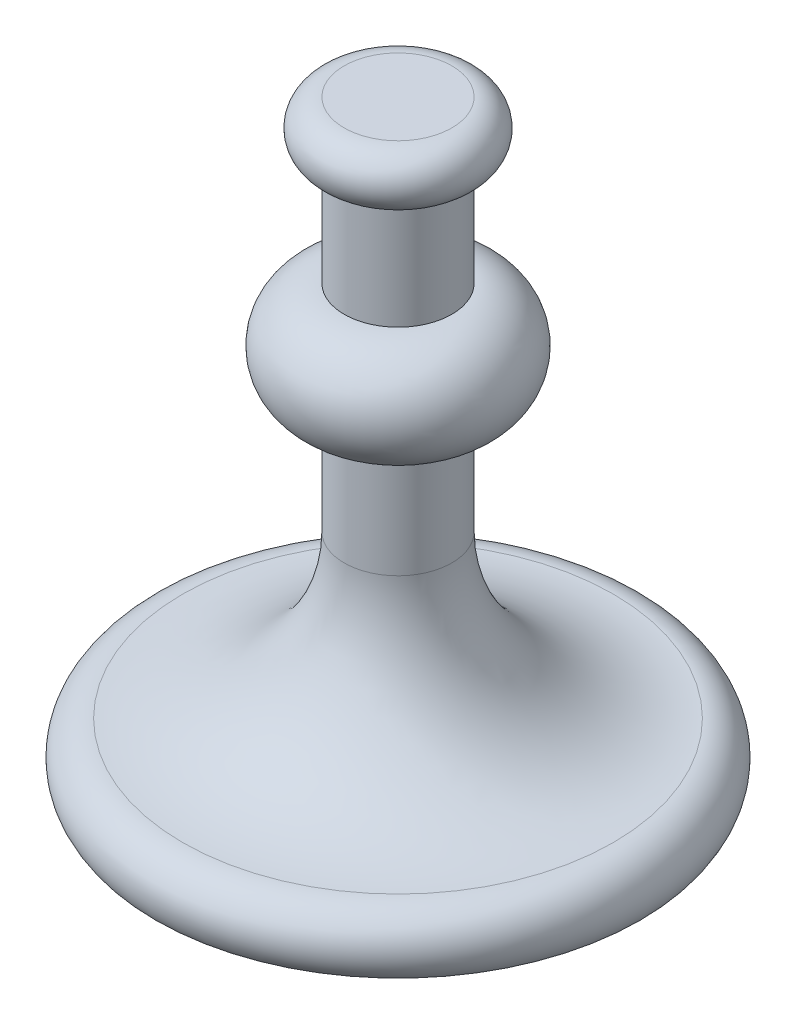
ISO-10303-21;
HEADER;
FILE_DESCRIPTION(('STEP AP214'),'2;1');
FILE_NAME('part.step','',(''),(''),'','','');
FILE_SCHEMA(('AUTOMOTIVE_DESIGN { 1 0 10303 214 1 1 1 1 }'));
ENDSEC;
DATA;
#1=APPLICATION_CONTEXT('core data for automotive mechanical design processes');
#2=APPLICATION_PROTOCOL_DEFINITION('international standard','automotive_design',2000,#1);
#3=PRODUCT_CONTEXT('',#1,'mechanical');
#4=PRODUCT('Part','Part','',(#3));
#5=PRODUCT_RELATED_PRODUCT_CATEGORY('part','',(#4));
#6=PRODUCT_DEFINITION_FORMATION('','',#4);
#7=PRODUCT_DEFINITION_CONTEXT('part definition',#1,'design');
#8=PRODUCT_DEFINITION('design','',#6,#7);
#9=PRODUCT_DEFINITION_SHAPE('','',#8);
#10=(LENGTH_UNIT() NAMED_UNIT(*) SI_UNIT(.MILLI.,.METRE.));
#11=(NAMED_UNIT(*) PLANE_ANGLE_UNIT() SI_UNIT($,.RADIAN.));
#12=(NAMED_UNIT(*) SI_UNIT($,.STERADIAN.) SOLID_ANGLE_UNIT());
#13=UNCERTAINTY_MEASURE_WITH_UNIT(LENGTH_MEASURE(1.E-05),#10,'distance_accuracy_value','');
#14=(GEOMETRIC_REPRESENTATION_CONTEXT(3) GLOBAL_UNCERTAINTY_ASSIGNED_CONTEXT((#13)) GLOBAL_UNIT_ASSIGNED_CONTEXT((#10,
#11,#12)) REPRESENTATION_CONTEXT('',''));
#15=CARTESIAN_POINT('',(0.,0.,0.));
#16=DIRECTION('',(0.,0.,1.));
#17=DIRECTION('',(1.,0.,0.));
#18=AXIS2_PLACEMENT_3D('',#15,#16,#17);
#19=CARTESIAN_POINT('',(0.,0.,0.));
#20=DIRECTION('',(0.,-1.,0.));
#21=DIRECTION('',(0.,0.,-1.));
#22=AXIS2_PLACEMENT_3D('',#19,#20,#21);
#23=PLANE('',#22);
#24=CARTESIAN_POINT('',(0.,0.,0.));
#25=DIRECTION('',(0.,-1.,0.));
#26=DIRECTION('',(0.,0.,-1.));
#27=AXIS2_PLACEMENT_3D('',#24,#25,#26);
#28=CIRCLE('',#27,90.);
#29=CARTESIAN_POINT('',(0.,0.,-90.));
#30=VERTEX_POINT('',#29);
#31=EDGE_CURVE('E73',#30,#30,#28,.T.);
#32=ORIENTED_EDGE('',*,*,#31,.T.);
#33=EDGE_LOOP('',(#32));
#34=FACE_BOUND('',#33,.T.);
#35=ADVANCED_FACE('F43',(#34),#23,.T.);
#36=CARTESIAN_POINT('',(0.,220.,0.));
#37=DIRECTION('',(0.,1.,0.));
#38=DIRECTION('',(0.,0.,1.));
#39=AXIS2_PLACEMENT_3D('',#36,#37,#38);
#40=PLANE('',#39);
#41=CARTESIAN_POINT('',(0.,220.,0.));
#42=DIRECTION('',(0.,-1.,0.));
#43=DIRECTION('',(0.,0.,-1.));
#44=AXIS2_PLACEMENT_3D('',#41,#42,#43);
#45=CIRCLE('',#44,20.);
#46=CARTESIAN_POINT('',(0.,220.,-20.));
#47=VERTEX_POINT('',#46);
#48=EDGE_CURVE('E10',#47,#47,#45,.T.);
#49=ORIENTED_EDGE('',*,*,#48,.F.);
#50=EDGE_LOOP('',(#49));
#51=FACE_BOUND('',#50,.T.);
#52=ADVANCED_FACE('F95',(#51),#40,.T.);
#53=CARTESIAN_POINT('',(0.,210.,0.));
#54=DIRECTION('',(0.,-1.,0.));
#55=DIRECTION('',(0.,0.,-1.));
#56=AXIS2_PLACEMENT_3D('',#53,#54,#55);
#57=TOROIDAL_SURFACE('',#56,20.,9.99999999999999);
#58=ORIENTED_EDGE('',*,*,#48,.T.);
#59=EDGE_LOOP('',(#58));
#60=FACE_BOUND('',#59,.T.);
#61=CARTESIAN_POINT('',(0.,200.,0.));
#62=DIRECTION('',(0.,-1.,0.));
#63=DIRECTION('',(0.,0.,-1.));
#64=AXIS2_PLACEMENT_3D('',#61,#62,#63);
#65=CIRCLE('',#64,20.);
#66=CARTESIAN_POINT('',(0.,200.,-20.));
#67=VERTEX_POINT('',#66);
#68=EDGE_CURVE('E49',#67,#67,#65,.T.);
#69=ORIENTED_EDGE('',*,*,#68,.F.);
#70=EDGE_LOOP('',(#69));
#71=FACE_BOUND('',#70,.T.);
#72=ADVANCED_FACE('F96',(#60,#71),#57,.T.);
#73=CARTESIAN_POINT('',(0.,0.,0.));
#74=DIRECTION('',(0.,-1.,0.));
#75=DIRECTION('',(0.,0.,-1.));
#76=AXIS2_PLACEMENT_3D('',#73,#74,#75);
#77=CYLINDRICAL_SURFACE('',#76,20.);
#78=ORIENTED_EDGE('',*,*,#68,.T.);
#79=EDGE_LOOP('',(#78));
#80=FACE_BOUND('',#79,.T.);
#81=CARTESIAN_POINT('',(0.,160.,0.));
#82=DIRECTION('',(0.,-1.,0.));
#83=DIRECTION('',(0.,0.,-1.));
#84=AXIS2_PLACEMENT_3D('',#81,#82,#83);
#85=CIRCLE('',#84,20.);
#86=CARTESIAN_POINT('',(0.,160.,-20.));
#87=VERTEX_POINT('',#86);
#88=EDGE_CURVE('E54',#87,#87,#85,.T.);
#89=ORIENTED_EDGE('',*,*,#88,.F.);
#90=EDGE_LOOP('',(#89));
#91=FACE_BOUND('',#90,.T.);
#92=ADVANCED_FACE('F102',(#80,#91),#77,.T.);
#93=CARTESIAN_POINT('',(0.,140.,0.));
#94=DIRECTION('',(0.,-1.,0.));
#95=DIRECTION('',(0.,0.,-1.));
#96=AXIS2_PLACEMENT_3D('',#93,#94,#95);
#97=TOROIDAL_SURFACE('',#96,20.,20.);
#98=ORIENTED_EDGE('',*,*,#88,.T.);
#99=EDGE_LOOP('',(#98));
#100=FACE_BOUND('',#99,.T.);
#101=CARTESIAN_POINT('',(0.,120.,0.));
#102=DIRECTION('',(0.,-1.,0.));
#103=DIRECTION('',(0.,0.,-1.));
#104=AXIS2_PLACEMENT_3D('',#101,#102,#103);
#105=CIRCLE('',#104,20.);
#106=CARTESIAN_POINT('',(0.,120.,-20.));
#107=VERTEX_POINT('',#106);
#108=EDGE_CURVE('E58',#107,#107,#105,.T.);
#109=ORIENTED_EDGE('',*,*,#108,.F.);
#110=EDGE_LOOP('',(#109));
#111=FACE_BOUND('',#110,.T.);
#112=ADVANCED_FACE('F106',(#100,#111),#97,.T.);
#113=CARTESIAN_POINT('',(0.,0.,0.));
#114=DIRECTION('',(0.,-1.,0.));
#115=DIRECTION('',(0.,0.,-1.));
#116=AXIS2_PLACEMENT_3D('',#113,#114,#115);
#117=CYLINDRICAL_SURFACE('',#116,20.);
#118=ORIENTED_EDGE('',*,*,#108,.T.);
#119=EDGE_LOOP('',(#118));
#120=FACE_BOUND('',#119,.T.);
#121=CARTESIAN_POINT('',(0.,80.,0.));
#122=DIRECTION('',(0.,-1.,0.));
#123=DIRECTION('',(0.,0.,-1.));
#124=AXIS2_PLACEMENT_3D('',#121,#122,#123);
#125=CIRCLE('',#124,20.);
#126=CARTESIAN_POINT('',(0.,80.,-20.));
#127=VERTEX_POINT('',#126);
#128=EDGE_CURVE('E67',#127,#127,#125,.T.);
#129=ORIENTED_EDGE('',*,*,#128,.F.);
#130=EDGE_LOOP('',(#129));
#131=FACE_BOUND('',#130,.T.);
#132=ADVANCED_FACE('F88',(#120,#131),#117,.T.);
#133=CARTESIAN_POINT('',(0.,80.,0.));
#134=DIRECTION('',(0.,-1.,0.));
#135=DIRECTION('',(0.,0.,-1.));
#136=AXIS2_PLACEMENT_3D('',#133,#134,#135);
#137=TOROIDAL_SURFACE('',#136,80.,60.);
#138=ORIENTED_EDGE('',*,*,#128,.T.);
#139=EDGE_LOOP('',(#138));
#140=FACE_BOUND('',#139,.T.);
#141=CARTESIAN_POINT('',(0.,20.,0.));
#142=DIRECTION('',(0.,-1.,0.));
#143=DIRECTION('',(0.,0.,-1.));
#144=AXIS2_PLACEMENT_3D('',#141,#142,#143);
#145=CIRCLE('',#144,79.9999999999999);
#146=CARTESIAN_POINT('',(0.,20.,-79.9999999999999));
#147=VERTEX_POINT('',#146);
#148=EDGE_CURVE('E68',#147,#147,#145,.T.);
#149=ORIENTED_EDGE('',*,*,#148,.F.);
#150=EDGE_LOOP('',(#149));
#151=FACE_BOUND('',#150,.T.);
#152=ADVANCED_FACE('F85',(#140,#151),#137,.F.);
#153=CARTESIAN_POINT('',(0.,7.49999999999998,0.));
#154=DIRECTION('',(0.,-1.,0.));
#155=DIRECTION('',(0.,0.,-1.));
#156=AXIS2_PLACEMENT_3D('',#153,#154,#155);
#157=TOROIDAL_SURFACE('',#156,80.,12.5);
#158=ORIENTED_EDGE('',*,*,#148,.T.);
#159=EDGE_LOOP('',(#158));
#160=FACE_BOUND('',#159,.T.);
#161=ORIENTED_EDGE('',*,*,#31,.F.);
#162=EDGE_LOOP('',(#161));
#163=FACE_BOUND('',#162,.T.);
#164=ADVANCED_FACE('F79',(#160,#163),#157,.T.);
#165=CLOSED_SHELL('',(#35,#52,#72,#92,#112,#132,#152,#164));
#166=MANIFOLD_SOLID_BREP('B2',#165);
#167=ADVANCED_BREP_SHAPE_REPRESENTATION('',(#18,#166),#14);
#168=SHAPE_DEFINITION_REPRESENTATION(#9,#167);
ENDSEC;
END-ISO-10303-21;
